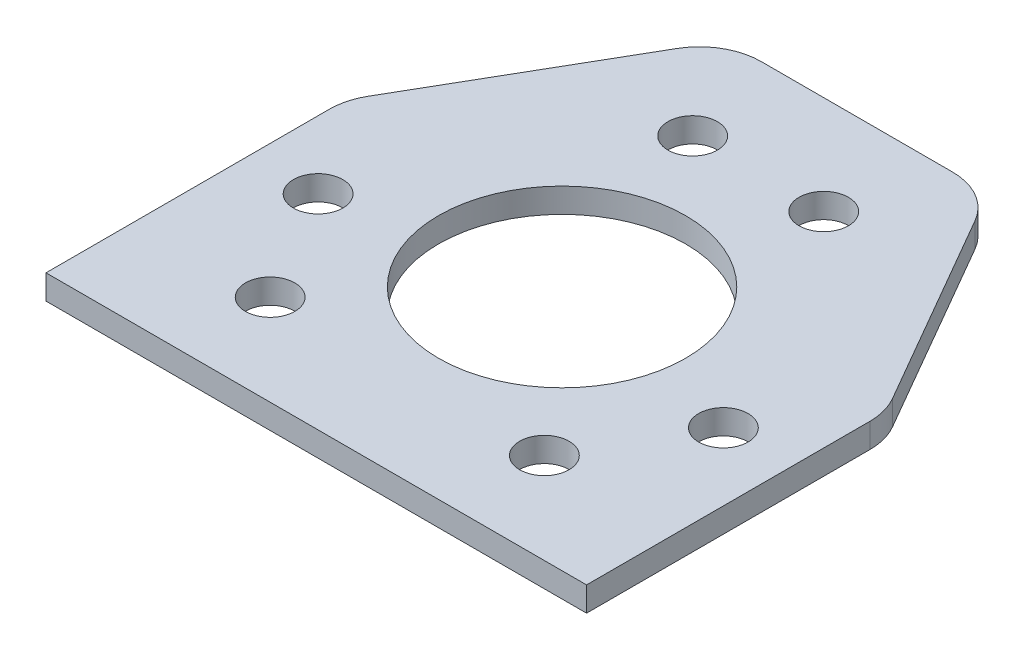
ISO-10303-21;
HEADER;
FILE_DESCRIPTION(('STEP AP214'),'2;1');
FILE_NAME('part.step','',(''),(''),'','','');
FILE_SCHEMA(('AUTOMOTIVE_DESIGN { 1 0 10303 214 1 1 1 1 }'));
ENDSEC;
DATA;
#1=APPLICATION_CONTEXT('core data for automotive mechanical design processes');
#2=APPLICATION_PROTOCOL_DEFINITION('international standard','automotive_design',2000,#1);
#3=PRODUCT_CONTEXT('',#1,'mechanical');
#4=PRODUCT('Part','Part','',(#3));
#5=PRODUCT_RELATED_PRODUCT_CATEGORY('part','',(#4));
#6=PRODUCT_DEFINITION_FORMATION('','',#4);
#7=PRODUCT_DEFINITION_CONTEXT('part definition',#1,'design');
#8=PRODUCT_DEFINITION('design','',#6,#7);
#9=PRODUCT_DEFINITION_SHAPE('','',#8);
#10=(LENGTH_UNIT() NAMED_UNIT(*) SI_UNIT(.MILLI.,.METRE.));
#11=(NAMED_UNIT(*) PLANE_ANGLE_UNIT() SI_UNIT($,.RADIAN.));
#12=(NAMED_UNIT(*) SI_UNIT($,.STERADIAN.) SOLID_ANGLE_UNIT());
#13=UNCERTAINTY_MEASURE_WITH_UNIT(LENGTH_MEASURE(1.E-05),#10,'distance_accuracy_value','');
#14=(GEOMETRIC_REPRESENTATION_CONTEXT(3) GLOBAL_UNCERTAINTY_ASSIGNED_CONTEXT((#13)) GLOBAL_UNIT_ASSIGNED_CONTEXT((#10,
#11,#12)) REPRESENTATION_CONTEXT('',''));
#15=CARTESIAN_POINT('',(0.,0.,0.));
#16=DIRECTION('',(0.,0.,1.));
#17=DIRECTION('',(1.,0.,0.));
#18=AXIS2_PLACEMENT_3D('',#15,#16,#17);
#19=CARTESIAN_POINT('',(0.,1.58750000000001,0.));
#20=DIRECTION('',(0.,1.,0.));
#21=DIRECTION('',(0.,0.,1.));
#22=AXIS2_PLACEMENT_3D('',#19,#20,#21);
#23=PLANE('',#22);
#24=CARTESIAN_POINT('',(-8.87720228450276,1.58749999999996,10.0242346141748));
#25=DIRECTION('',(0.,1.,0.));
#26=DIRECTION('',(0.,0.,1.));
#27=AXIS2_PLACEMENT_3D('',#24,#25,#26);
#28=CIRCLE('',#27,1.59999999999999);
#29=CARTESIAN_POINT('',(-8.87720228450276,1.58749999999996,11.6242346141748));
#30=VERTEX_POINT('',#29);
#31=EDGE_CURVE('E272',#30,#30,#28,.T.);
#32=ORIENTED_EDGE('',*,*,#31,.F.);
#33=EDGE_LOOP('',(#32));
#34=FACE_BOUND('',#33,.T.);
#35=CARTESIAN_POINT('',(-13.119842971622,1.58750000000001,2.67576538582523));
#36=DIRECTION('',(0.,1.,0.));
#37=DIRECTION('',(0.,0.,1.));
#38=AXIS2_PLACEMENT_3D('',#35,#36,#37);
#39=CIRCLE('',#38,1.59999999999999);
#40=CARTESIAN_POINT('',(-13.119842971622,1.58750000000001,4.27576538582522));
#41=VERTEX_POINT('',#40);
#42=EDGE_CURVE('E266',#41,#41,#39,.T.);
#43=ORIENTED_EDGE('',*,*,#42,.F.);
#44=EDGE_LOOP('',(#43));
#45=FACE_BOUND('',#44,.T.);
#46=CARTESIAN_POINT('',(-4.2426406871192,1.58749999999996,-12.7));
#47=DIRECTION('',(0.,1.,0.));
#48=DIRECTION('',(0.,0.,1.));
#49=AXIS2_PLACEMENT_3D('',#46,#47,#48);
#50=CIRCLE('',#49,1.59999999999999);
#51=CARTESIAN_POINT('',(-4.2426406871192,1.58749999999996,-11.1));
#52=VERTEX_POINT('',#51);
#53=EDGE_CURVE('E260',#52,#52,#50,.T.);
#54=ORIENTED_EDGE('',*,*,#53,.F.);
#55=EDGE_LOOP('',(#54));
#56=FACE_BOUND('',#55,.T.);
#57=CARTESIAN_POINT('',(4.24264068711939,1.58750000000001,-12.7));
#58=DIRECTION('',(0.,1.,0.));
#59=DIRECTION('',(0.,0.,1.));
#60=AXIS2_PLACEMENT_3D('',#57,#58,#59);
#61=CIRCLE('',#60,1.59999999999999);
#62=CARTESIAN_POINT('',(4.24264068711939,1.58750000000001,-11.1));
#63=VERTEX_POINT('',#62);
#64=EDGE_CURVE('E254',#63,#63,#61,.T.);
#65=ORIENTED_EDGE('',*,*,#64,.F.);
#66=EDGE_LOOP('',(#65));
#67=FACE_BOUND('',#66,.T.);
#68=CARTESIAN_POINT('',(13.119842971622,1.58749999999996,2.67576538582523));
#69=DIRECTION('',(0.,1.,0.));
#70=DIRECTION('',(0.,0.,1.));
#71=AXIS2_PLACEMENT_3D('',#68,#69,#70);
#72=CIRCLE('',#71,1.59999999999999);
#73=CARTESIAN_POINT('',(13.119842971622,1.58749999999996,4.27576538582522));
#74=VERTEX_POINT('',#73);
#75=EDGE_CURVE('E248',#74,#74,#72,.T.);
#76=ORIENTED_EDGE('',*,*,#75,.F.);
#77=EDGE_LOOP('',(#76));
#78=FACE_BOUND('',#77,.T.);
#79=CARTESIAN_POINT('',(8.8772022845027,1.58750000000001,10.0242346141748));
#80=DIRECTION('',(0.,1.,0.));
#81=DIRECTION('',(0.,0.,1.));
#82=AXIS2_PLACEMENT_3D('',#79,#80,#81);
#83=CIRCLE('',#82,1.59999999999999);
#84=CARTESIAN_POINT('',(8.8772022845027,1.58750000000001,11.6242346141748));
#85=VERTEX_POINT('',#84);
#86=EDGE_CURVE('E242',#85,#85,#83,.T.);
#87=ORIENTED_EDGE('',*,*,#86,.F.);
#88=EDGE_LOOP('',(#87));
#89=FACE_BOUND('',#88,.T.);
#90=DIRECTION('',(-0.500000000000001,0.,0.866025403784438));
#91=VECTOR('',#90,1.);
#92=CARTESIAN_POINT('',(-8.49999999999988,1.58749999999996,-19.0854174377006));
#93=LINE('',#92,#91);
#94=CARTESIAN_POINT('',(-9.65470053837914,1.58749999999996,-17.0854174377006));
#95=VERTEX_POINT('',#94);
#96=CARTESIAN_POINT('',(-16.9641016151377,1.58750000000001,-4.42516339985621));
#97=VERTEX_POINT('',#96);
#98=EDGE_CURVE('E140',#95,#97,#93,.T.);
#99=ORIENTED_EDGE('',*,*,#98,.T.);
#100=CARTESIAN_POINT('',(-13.5,1.58750000000001,-2.42516339985618));
#101=DIRECTION('',(0.,1.,0.));
#102=DIRECTION('',(0.,0.,1.));
#103=AXIS2_PLACEMENT_3D('',#100,#101,#102);
#104=CIRCLE('',#103,4.);
#105=CARTESIAN_POINT('',(-17.5,1.58750000000001,-2.42516339985618));
#106=VERTEX_POINT('',#105);
#107=EDGE_CURVE('E136',#97,#106,#104,.T.);
#108=ORIENTED_EDGE('',*,*,#107,.T.);
#109=DIRECTION('',(0.,0.,1.));
#110=VECTOR('',#109,1.);
#111=CARTESIAN_POINT('',(-17.5,1.58750000000001,-3.49696016958068));
#112=LINE('',#111,#110);
#113=CARTESIAN_POINT('',(-17.5,1.58750000000001,15.9145825622994));
#114=VERTEX_POINT('',#113);
#115=EDGE_CURVE('E127',#106,#114,#112,.T.);
#116=ORIENTED_EDGE('',*,*,#115,.T.);
#117=DIRECTION('',(1.,0.,0.));
#118=VECTOR('',#117,1.);
#119=CARTESIAN_POINT('',(-17.5,1.58750000000001,15.9145825622994));
#120=LINE('',#119,#118);
#121=CARTESIAN_POINT('',(17.5,1.58749999999995,15.9145825622994));
#122=VERTEX_POINT('',#121);
#123=EDGE_CURVE('E133',#114,#122,#120,.T.);
#124=ORIENTED_EDGE('',*,*,#123,.T.);
#125=DIRECTION('',(0.,0.,-1.));
#126=VECTOR('',#125,1.);
#127=CARTESIAN_POINT('',(17.5,1.58749999999995,-3.49696016958068));
#128=LINE('',#127,#126);
#129=CARTESIAN_POINT('',(17.5,1.58749999999995,-2.42516339985618));
#130=VERTEX_POINT('',#129);
#131=EDGE_CURVE('E155',#122,#130,#128,.T.);
#132=ORIENTED_EDGE('',*,*,#131,.T.);
#133=CARTESIAN_POINT('',(13.5,1.58749999999996,-2.42516339985618));
#134=DIRECTION('',(0.,1.,0.));
#135=DIRECTION('',(0.,0.,1.));
#136=AXIS2_PLACEMENT_3D('',#133,#134,#135);
#137=CIRCLE('',#136,4.);
#138=CARTESIAN_POINT('',(16.9641016151379,1.58749999999995,-4.42516339985621));
#139=VERTEX_POINT('',#138);
#140=EDGE_CURVE('E195',#130,#139,#137,.T.);
#141=ORIENTED_EDGE('',*,*,#140,.T.);
#142=DIRECTION('',(-0.500000000000001,0.,-0.866025403784438));
#143=VECTOR('',#142,1.);
#144=CARTESIAN_POINT('',(8.50000000000008,1.58750000000001,-19.0854174377006));
#145=LINE('',#144,#143);
#146=CARTESIAN_POINT('',(9.65470053837933,1.58750000000001,-17.0854174377006));
#147=VERTEX_POINT('',#146);
#148=EDGE_CURVE('E157',#139,#147,#145,.T.);
#149=ORIENTED_EDGE('',*,*,#148,.T.);
#150=CARTESIAN_POINT('',(6.19059892324157,1.58750000000001,-15.0854174377006));
#151=DIRECTION('',(0.,1.,0.));
#152=DIRECTION('',(0.,0.,1.));
#153=AXIS2_PLACEMENT_3D('',#150,#151,#152);
#154=CIRCLE('',#153,4.);
#155=CARTESIAN_POINT('',(6.19059892324157,1.58750000000001,-19.0854174377006));
#156=VERTEX_POINT('',#155);
#157=EDGE_CURVE('E73',#147,#156,#154,.T.);
#158=ORIENTED_EDGE('',*,*,#157,.T.);
#159=DIRECTION('',(-1.,0.,0.));
#160=VECTOR('',#159,1.);
#161=CARTESIAN_POINT('',(8.50000000000008,1.58750000000001,-19.0854174377006));
#162=LINE('',#161,#160);
#163=CARTESIAN_POINT('',(-6.19059892324138,1.58749999999996,-19.0854174377006));
#164=VERTEX_POINT('',#163);
#165=EDGE_CURVE('E162',#156,#164,#162,.T.);
#166=ORIENTED_EDGE('',*,*,#165,.T.);
#167=CARTESIAN_POINT('',(-6.19059892324138,1.58749999999996,-15.0854174377006));
#168=DIRECTION('',(0.,1.,0.));
#169=DIRECTION('',(0.,0.,1.));
#170=AXIS2_PLACEMENT_3D('',#167,#168,#169);
#171=CIRCLE('',#170,4.);
#172=EDGE_CURVE('E197',#164,#95,#171,.T.);
#173=ORIENTED_EDGE('',*,*,#172,.T.);
#174=EDGE_LOOP('',(#99,#108,#116,#124,#132,#141,#149,#158,#166,#173));
#175=FACE_BOUND('',#174,.T.);
#176=CARTESIAN_POINT('',(0.,1.58750000000001,0.));
#177=DIRECTION('',(0.,1.,0.));
#178=DIRECTION('',(0.,0.,1.));
#179=AXIS2_PLACEMENT_3D('',#176,#177,#178);
#180=CIRCLE('',#179,8.);
#181=CARTESIAN_POINT('',(0.,1.58750000000001,8.));
#182=VERTEX_POINT('',#181);
#183=EDGE_CURVE('E167',#182,#182,#180,.T.);
#184=ORIENTED_EDGE('',*,*,#183,.F.);
#185=EDGE_LOOP('',(#184));
#186=FACE_BOUND('',#185,.T.);
#187=ADVANCED_FACE('F51',(#34,#45,#56,#67,#78,#89,#175,#186),#23,.T.);
#188=CARTESIAN_POINT('',(0.,0.,0.));
#189=DIRECTION('',(0.,1.,0.));
#190=DIRECTION('',(0.,0.,1.));
#191=AXIS2_PLACEMENT_3D('',#188,#189,#190);
#192=PLANE('',#191);
#193=CARTESIAN_POINT('',(-8.87720228450273,0.,10.0242346141748));
#194=DIRECTION('',(0.,1.,0.));
#195=DIRECTION('',(0.,0.,1.));
#196=AXIS2_PLACEMENT_3D('',#193,#194,#195);
#197=CIRCLE('',#196,1.6);
#198=CARTESIAN_POINT('',(-8.87720228450273,0.,11.6242346141748));
#199=VERTEX_POINT('',#198);
#200=EDGE_CURVE('E269',#199,#199,#197,.T.);
#201=ORIENTED_EDGE('',*,*,#200,.T.);
#202=EDGE_LOOP('',(#201));
#203=FACE_BOUND('',#202,.T.);
#204=CARTESIAN_POINT('',(-13.119842971622,0.,2.67576538582523));
#205=DIRECTION('',(0.,1.,0.));
#206=DIRECTION('',(0.,0.,1.));
#207=AXIS2_PLACEMENT_3D('',#204,#205,#206);
#208=CIRCLE('',#207,1.6);
#209=CARTESIAN_POINT('',(-13.119842971622,0.,4.27576538582523));
#210=VERTEX_POINT('',#209);
#211=EDGE_CURVE('E263',#210,#210,#208,.T.);
#212=ORIENTED_EDGE('',*,*,#211,.T.);
#213=EDGE_LOOP('',(#212));
#214=FACE_BOUND('',#213,.T.);
#215=CARTESIAN_POINT('',(-4.24264068711917,0.,-12.7));
#216=DIRECTION('',(0.,1.,0.));
#217=DIRECTION('',(0.,0.,1.));
#218=AXIS2_PLACEMENT_3D('',#215,#216,#217);
#219=CIRCLE('',#218,1.6);
#220=CARTESIAN_POINT('',(-4.24264068711917,0.,-11.1));
#221=VERTEX_POINT('',#220);
#222=EDGE_CURVE('E257',#221,#221,#219,.T.);
#223=ORIENTED_EDGE('',*,*,#222,.T.);
#224=EDGE_LOOP('',(#223));
#225=FACE_BOUND('',#224,.T.);
#226=CARTESIAN_POINT('',(4.24264068711941,0.,-12.7));
#227=DIRECTION('',(0.,1.,0.));
#228=DIRECTION('',(0.,0.,1.));
#229=AXIS2_PLACEMENT_3D('',#226,#227,#228);
#230=CIRCLE('',#229,1.6);
#231=CARTESIAN_POINT('',(4.24264068711941,0.,-11.1));
#232=VERTEX_POINT('',#231);
#233=EDGE_CURVE('E251',#232,#232,#230,.T.);
#234=ORIENTED_EDGE('',*,*,#233,.T.);
#235=EDGE_LOOP('',(#234));
#236=FACE_BOUND('',#235,.T.);
#237=CARTESIAN_POINT('',(13.119842971622,0.,2.67576538582523));
#238=DIRECTION('',(0.,1.,0.));
#239=DIRECTION('',(0.,0.,1.));
#240=AXIS2_PLACEMENT_3D('',#237,#238,#239);
#241=CIRCLE('',#240,1.6);
#242=CARTESIAN_POINT('',(13.119842971622,0.,4.27576538582523));
#243=VERTEX_POINT('',#242);
#244=EDGE_CURVE('E245',#243,#243,#241,.T.);
#245=ORIENTED_EDGE('',*,*,#244,.T.);
#246=EDGE_LOOP('',(#245));
#247=FACE_BOUND('',#246,.T.);
#248=CARTESIAN_POINT('',(8.87720228450273,0.,10.0242346141748));
#249=DIRECTION('',(0.,1.,0.));
#250=DIRECTION('',(0.,0.,1.));
#251=AXIS2_PLACEMENT_3D('',#248,#249,#250);
#252=CIRCLE('',#251,1.6);
#253=CARTESIAN_POINT('',(8.87720228450273,0.,11.6242346141748));
#254=VERTEX_POINT('',#253);
#255=EDGE_CURVE('E237',#254,#254,#252,.T.);
#256=ORIENTED_EDGE('',*,*,#255,.T.);
#257=EDGE_LOOP('',(#256));
#258=FACE_BOUND('',#257,.T.);
#259=DIRECTION('',(0.,0.,1.));
#260=VECTOR('',#259,1.);
#261=CARTESIAN_POINT('',(-17.4999999999999,0.,-3.49696016958068));
#262=LINE('',#261,#260);
#263=CARTESIAN_POINT('',(-17.4999999999999,0.,-2.42516339985618));
#264=VERTEX_POINT('',#263);
#265=CARTESIAN_POINT('',(-17.5,0.,15.9145825622994));
#266=VERTEX_POINT('',#265);
#267=EDGE_CURVE('E146',#264,#266,#262,.T.);
#268=ORIENTED_EDGE('',*,*,#267,.F.);
#269=CARTESIAN_POINT('',(-13.4999999999999,0.,-2.42516339985618));
#270=DIRECTION('',(0.,1.,0.));
#271=DIRECTION('',(0.,0.,1.));
#272=AXIS2_PLACEMENT_3D('',#269,#270,#271);
#273=CIRCLE('',#272,4.);
#274=CARTESIAN_POINT('',(-16.9641016151376,0.,-4.42516339985621));
#275=VERTEX_POINT('',#274);
#276=EDGE_CURVE('E187',#264,#275,#273,.F.);
#277=ORIENTED_EDGE('',*,*,#276,.T.);
#278=DIRECTION('',(-0.500000000000001,0.,0.866025403784438));
#279=VECTOR('',#278,1.);
#280=CARTESIAN_POINT('',(-8.49999999999985,0.,-19.0854174377006));
#281=LINE('',#280,#279);
#282=CARTESIAN_POINT('',(-9.65470053837911,0.,-17.0854174377006));
#283=VERTEX_POINT('',#282);
#284=EDGE_CURVE('E164',#283,#275,#281,.T.);
#285=ORIENTED_EDGE('',*,*,#284,.F.);
#286=CARTESIAN_POINT('',(-6.19059892324135,0.,-15.0854174377006));
#287=DIRECTION('',(0.,1.,0.));
#288=DIRECTION('',(0.,0.,1.));
#289=AXIS2_PLACEMENT_3D('',#286,#287,#288);
#290=CIRCLE('',#289,4.);
#291=CARTESIAN_POINT('',(-6.19059892324135,0.,-19.0854174377006));
#292=VERTEX_POINT('',#291);
#293=EDGE_CURVE('E185',#283,#292,#290,.F.);
#294=ORIENTED_EDGE('',*,*,#293,.T.);
#295=DIRECTION('',(-1.,0.,0.));
#296=VECTOR('',#295,1.);
#297=CARTESIAN_POINT('',(8.5000000000001,0.,-19.0854174377006));
#298=LINE('',#297,#296);
#299=CARTESIAN_POINT('',(6.1905989232416,0.,-19.0854174377006));
#300=VERTEX_POINT('',#299);
#301=EDGE_CURVE('E177',#300,#292,#298,.T.);
#302=ORIENTED_EDGE('',*,*,#301,.F.);
#303=CARTESIAN_POINT('',(6.1905989232416,0.,-15.0854174377006));
#304=DIRECTION('',(0.,1.,0.));
#305=DIRECTION('',(0.,0.,1.));
#306=AXIS2_PLACEMENT_3D('',#303,#304,#305);
#307=CIRCLE('',#306,4.);
#308=CARTESIAN_POINT('',(9.65470053837936,0.,-17.0854174377006));
#309=VERTEX_POINT('',#308);
#310=EDGE_CURVE('E181',#300,#309,#307,.F.);
#311=ORIENTED_EDGE('',*,*,#310,.T.);
#312=DIRECTION('',(-0.500000000000001,0.,-0.866025403784438));
#313=VECTOR('',#312,1.);
#314=CARTESIAN_POINT('',(8.5000000000001,0.,-19.0854174377006));
#315=LINE('',#314,#313);
#316=CARTESIAN_POINT('',(16.9641016151379,0.,-4.42516339985621));
#317=VERTEX_POINT('',#316);
#318=EDGE_CURVE('E174',#317,#309,#315,.T.);
#319=ORIENTED_EDGE('',*,*,#318,.F.);
#320=CARTESIAN_POINT('',(13.5000000000001,0.,-2.42516339985618));
#321=DIRECTION('',(0.,1.,0.));
#322=DIRECTION('',(0.,0.,1.));
#323=AXIS2_PLACEMENT_3D('',#320,#321,#322);
#324=CIRCLE('',#323,4.);
#325=CARTESIAN_POINT('',(17.5000000000001,0.,-2.42516339985618));
#326=VERTEX_POINT('',#325);
#327=EDGE_CURVE('E183',#317,#326,#324,.F.);
#328=ORIENTED_EDGE('',*,*,#327,.T.);
#329=DIRECTION('',(0.,0.,-1.));
#330=VECTOR('',#329,1.);
#331=CARTESIAN_POINT('',(17.5000000000001,0.,-3.49696016958068));
#332=LINE('',#331,#330);
#333=CARTESIAN_POINT('',(17.5,0.,15.9145825622994));
#334=VERTEX_POINT('',#333);
#335=EDGE_CURVE('E171',#334,#326,#332,.T.);
#336=ORIENTED_EDGE('',*,*,#335,.F.);
#337=DIRECTION('',(1.,0.,0.));
#338=VECTOR('',#337,1.);
#339=CARTESIAN_POINT('',(-17.5,0.,15.9145825622994));
#340=LINE('',#339,#338);
#341=EDGE_CURVE('E169',#266,#334,#340,.T.);
#342=ORIENTED_EDGE('',*,*,#341,.F.);
#343=EDGE_LOOP('',(#268,#277,#285,#294,#302,#311,#319,#328,#336,#342));
#344=FACE_BOUND('',#343,.T.);
#345=CARTESIAN_POINT('',(0.,0.,0.));
#346=DIRECTION('',(0.,1.,0.));
#347=DIRECTION('',(0.,0.,1.));
#348=AXIS2_PLACEMENT_3D('',#345,#346,#347);
#349=CIRCLE('',#348,8.);
#350=CARTESIAN_POINT('',(0.,0.,8.));
#351=VERTEX_POINT('',#350);
#352=EDGE_CURVE('E234',#351,#351,#349,.T.);
#353=ORIENTED_EDGE('',*,*,#352,.T.);
#354=EDGE_LOOP('',(#353));
#355=FACE_BOUND('',#354,.T.);
#356=ADVANCED_FACE('F215',(#203,#214,#225,#236,#247,#258,#344,#355),#192,.F.);
#357=CARTESIAN_POINT('',(-8.49999999999988,1.58749999999996,-19.0854174377006));
#358=DIRECTION('',(0.866025403784438,0.,0.500000000000001));
#359=DIRECTION('',(0.500000000000001,0.,-0.866025403784438));
#360=AXIS2_PLACEMENT_3D('',#357,#358,#359);
#361=PLANE('',#360);
#362=ORIENTED_EDGE('',*,*,#284,.T.);
#363=DIRECTION('',(0.,-1.,0.));
#364=VECTOR('',#363,1.);
#365=CARTESIAN_POINT('',(-16.9641016151377,1.58750000000001,-4.42516339985619));
#366=LINE('',#365,#364);
#367=EDGE_CURVE('E192',#275,#97,#366,.F.);
#368=ORIENTED_EDGE('',*,*,#367,.T.);
#369=ORIENTED_EDGE('',*,*,#98,.F.);
#370=DIRECTION('',(0.,-1.,0.));
#371=VECTOR('',#370,1.);
#372=CARTESIAN_POINT('',(-9.65470053837914,1.58749999999996,-17.0854174377006));
#373=LINE('',#372,#371);
#374=EDGE_CURVE('E189',#95,#283,#373,.T.);
#375=ORIENTED_EDGE('',*,*,#374,.T.);
#376=EDGE_LOOP('',(#362,#368,#369,#375));
#377=FACE_BOUND('',#376,.T.);
#378=ADVANCED_FACE('F229',(#377),#361,.F.);
#379=CARTESIAN_POINT('',(-17.5,1.58750000000001,-3.49696016958068));
#380=DIRECTION('',(1.,0.,0.));
#381=DIRECTION('',(0.,0.,-1.));
#382=AXIS2_PLACEMENT_3D('',#379,#380,#381);
#383=PLANE('',#382);
#384=ORIENTED_EDGE('',*,*,#115,.F.);
#385=DIRECTION('',(0.,-1.,0.));
#386=VECTOR('',#385,1.);
#387=CARTESIAN_POINT('',(-17.5,1.58750000000001,-2.42516339985618));
#388=LINE('',#387,#386);
#389=EDGE_CURVE('E149',#106,#264,#388,.T.);
#390=ORIENTED_EDGE('',*,*,#389,.T.);
#391=ORIENTED_EDGE('',*,*,#267,.T.);
#392=DIRECTION('',(0.,-1.,0.));
#393=VECTOR('',#392,1.);
#394=CARTESIAN_POINT('',(-17.5,1.58750000000001,15.9145825622994));
#395=LINE('',#394,#393);
#396=EDGE_CURVE('E143',#114,#266,#395,.T.);
#397=ORIENTED_EDGE('',*,*,#396,.F.);
#398=EDGE_LOOP('',(#384,#390,#391,#397));
#399=FACE_BOUND('',#398,.T.);
#400=ADVANCED_FACE('F144',(#399),#383,.F.);
#401=CARTESIAN_POINT('',(-17.5,1.58750000000001,15.9145825622994));
#402=DIRECTION('',(0.,0.,-1.));
#403=DIRECTION('',(-1.,0.,0.));
#404=AXIS2_PLACEMENT_3D('',#401,#402,#403);
#405=PLANE('',#404);
#406=ORIENTED_EDGE('',*,*,#341,.T.);
#407=DIRECTION('',(0.,-1.,0.));
#408=VECTOR('',#407,1.);
#409=CARTESIAN_POINT('',(17.5,1.58749999999995,15.9145825622994));
#410=LINE('',#409,#408);
#411=EDGE_CURVE('E150',#122,#334,#410,.T.);
#412=ORIENTED_EDGE('',*,*,#411,.F.);
#413=ORIENTED_EDGE('',*,*,#123,.F.);
#414=ORIENTED_EDGE('',*,*,#396,.T.);
#415=EDGE_LOOP('',(#406,#412,#413,#414));
#416=FACE_BOUND('',#415,.T.);
#417=ADVANCED_FACE('F152',(#416),#405,.F.);
#418=CARTESIAN_POINT('',(17.5,1.58749999999995,-3.49696016958068));
#419=DIRECTION('',(-1.,0.,0.));
#420=DIRECTION('',(0.,0.,1.));
#421=AXIS2_PLACEMENT_3D('',#418,#419,#420);
#422=PLANE('',#421);
#423=ORIENTED_EDGE('',*,*,#335,.T.);
#424=DIRECTION('',(0.,-1.,0.));
#425=VECTOR('',#424,1.);
#426=CARTESIAN_POINT('',(17.5,1.58749999999995,-2.42516339985618));
#427=LINE('',#426,#425);
#428=EDGE_CURVE('E13',#326,#130,#427,.F.);
#429=ORIENTED_EDGE('',*,*,#428,.T.);
#430=ORIENTED_EDGE('',*,*,#131,.F.);
#431=ORIENTED_EDGE('',*,*,#411,.T.);
#432=EDGE_LOOP('',(#423,#429,#430,#431));
#433=FACE_BOUND('',#432,.T.);
#434=ADVANCED_FACE('F316',(#433),#422,.F.);
#435=CARTESIAN_POINT('',(8.50000000000008,1.58750000000001,-19.0854174377006));
#436=DIRECTION('',(-0.866025403784438,0.,0.500000000000001));
#437=DIRECTION('',(0.500000000000001,0.,0.866025403784438));
#438=AXIS2_PLACEMENT_3D('',#435,#436,#437);
#439=PLANE('',#438);
#440=ORIENTED_EDGE('',*,*,#148,.F.);
#441=DIRECTION('',(0.,-1.,0.));
#442=VECTOR('',#441,1.);
#443=CARTESIAN_POINT('',(16.9641016151379,1.58749999999995,-4.42516339985619));
#444=LINE('',#443,#442);
#445=EDGE_CURVE('E59',#139,#317,#444,.T.);
#446=ORIENTED_EDGE('',*,*,#445,.T.);
#447=ORIENTED_EDGE('',*,*,#318,.T.);
#448=DIRECTION('',(0.,-1.,0.));
#449=VECTOR('',#448,1.);
#450=CARTESIAN_POINT('',(9.65470053837933,1.58750000000001,-17.0854174377006));
#451=LINE('',#450,#449);
#452=EDGE_CURVE('E204',#309,#147,#451,.F.);
#453=ORIENTED_EDGE('',*,*,#452,.T.);
#454=EDGE_LOOP('',(#440,#446,#447,#453));
#455=FACE_BOUND('',#454,.T.);
#456=ADVANCED_FACE('F210',(#455),#439,.F.);
#457=CARTESIAN_POINT('',(8.50000000000008,1.58750000000001,-19.0854174377006));
#458=DIRECTION('',(0.,0.,1.));
#459=DIRECTION('',(1.,0.,0.));
#460=AXIS2_PLACEMENT_3D('',#457,#458,#459);
#461=PLANE('',#460);
#462=ORIENTED_EDGE('',*,*,#301,.T.);
#463=DIRECTION('',(0.,-1.,0.));
#464=VECTOR('',#463,1.);
#465=CARTESIAN_POINT('',(-6.19059892324138,1.58749999999996,-19.0854174377006));
#466=LINE('',#465,#464);
#467=EDGE_CURVE('E66',#292,#164,#466,.F.);
#468=ORIENTED_EDGE('',*,*,#467,.T.);
#469=ORIENTED_EDGE('',*,*,#165,.F.);
#470=DIRECTION('',(0.,-1.,0.));
#471=VECTOR('',#470,1.);
#472=CARTESIAN_POINT('',(6.19059892324157,1.58750000000001,-19.0854174377006));
#473=LINE('',#472,#471);
#474=EDGE_CURVE('E200',#156,#300,#473,.T.);
#475=ORIENTED_EDGE('',*,*,#474,.T.);
#476=EDGE_LOOP('',(#462,#468,#469,#475));
#477=FACE_BOUND('',#476,.T.);
#478=ADVANCED_FACE('F221',(#477),#461,.F.);
#479=CARTESIAN_POINT('',(0.,1.58750000000001,0.));
#480=DIRECTION('',(0.,-1.,0.));
#481=DIRECTION('',(0.,0.,-1.));
#482=AXIS2_PLACEMENT_3D('',#479,#480,#481);
#483=CYLINDRICAL_SURFACE('',#482,8.);
#484=ORIENTED_EDGE('',*,*,#183,.T.);
#485=EDGE_LOOP('',(#484));
#486=FACE_BOUND('',#485,.T.);
#487=ORIENTED_EDGE('',*,*,#352,.F.);
#488=EDGE_LOOP('',(#487));
#489=FACE_BOUND('',#488,.T.);
#490=ADVANCED_FACE('F294',(#486,#489),#483,.F.);
#491=CARTESIAN_POINT('',(8.8772022845027,1.58750000000001,10.0242346141748));
#492=DIRECTION('',(0.,1.,0.));
#493=DIRECTION('',(0.,0.,1.));
#494=AXIS2_PLACEMENT_3D('',#491,#492,#493);
#495=CYLINDRICAL_SURFACE('',#494,1.59999999999999);
#496=ORIENTED_EDGE('',*,*,#255,.F.);
#497=EDGE_LOOP('',(#496));
#498=FACE_BOUND('',#497,.T.);
#499=ORIENTED_EDGE('',*,*,#86,.T.);
#500=EDGE_LOOP('',(#499));
#501=FACE_BOUND('',#500,.T.);
#502=ADVANCED_FACE('F291',(#498,#501),#495,.F.);
#503=CARTESIAN_POINT('',(13.119842971622,1.58749999999996,2.67576538582523));
#504=DIRECTION('',(0.,1.,0.));
#505=DIRECTION('',(0.,0.,1.));
#506=AXIS2_PLACEMENT_3D('',#503,#504,#505);
#507=CYLINDRICAL_SURFACE('',#506,1.59999999999999);
#508=ORIENTED_EDGE('',*,*,#244,.F.);
#509=EDGE_LOOP('',(#508));
#510=FACE_BOUND('',#509,.T.);
#511=ORIENTED_EDGE('',*,*,#75,.T.);
#512=EDGE_LOOP('',(#511));
#513=FACE_BOUND('',#512,.T.);
#514=ADVANCED_FACE('F293',(#510,#513),#507,.F.);
#515=CARTESIAN_POINT('',(4.24264068711939,1.58750000000001,-12.7));
#516=DIRECTION('',(0.,1.,0.));
#517=DIRECTION('',(0.,0.,1.));
#518=AXIS2_PLACEMENT_3D('',#515,#516,#517);
#519=CYLINDRICAL_SURFACE('',#518,1.59999999999999);
#520=ORIENTED_EDGE('',*,*,#233,.F.);
#521=EDGE_LOOP('',(#520));
#522=FACE_BOUND('',#521,.T.);
#523=ORIENTED_EDGE('',*,*,#64,.T.);
#524=EDGE_LOOP('',(#523));
#525=FACE_BOUND('',#524,.T.);
#526=ADVANCED_FACE('F301',(#522,#525),#519,.F.);
#527=CARTESIAN_POINT('',(-4.2426406871192,1.58749999999995,-12.7));
#528=DIRECTION('',(0.,1.,0.));
#529=DIRECTION('',(0.,0.,1.));
#530=AXIS2_PLACEMENT_3D('',#527,#528,#529);
#531=CYLINDRICAL_SURFACE('',#530,1.59999999999999);
#532=ORIENTED_EDGE('',*,*,#222,.F.);
#533=EDGE_LOOP('',(#532));
#534=FACE_BOUND('',#533,.T.);
#535=ORIENTED_EDGE('',*,*,#53,.T.);
#536=EDGE_LOOP('',(#535));
#537=FACE_BOUND('',#536,.T.);
#538=ADVANCED_FACE('F362',(#534,#537),#531,.F.);
#539=CARTESIAN_POINT('',(-13.119842971622,1.58750000000001,2.67576538582523));
#540=DIRECTION('',(0.,1.,0.));
#541=DIRECTION('',(0.,0.,1.));
#542=AXIS2_PLACEMENT_3D('',#539,#540,#541);
#543=CYLINDRICAL_SURFACE('',#542,1.59999999999999);
#544=ORIENTED_EDGE('',*,*,#211,.F.);
#545=EDGE_LOOP('',(#544));
#546=FACE_BOUND('',#545,.T.);
#547=ORIENTED_EDGE('',*,*,#42,.T.);
#548=EDGE_LOOP('',(#547));
#549=FACE_BOUND('',#548,.T.);
#550=ADVANCED_FACE('F354',(#546,#549),#543,.F.);
#551=CARTESIAN_POINT('',(-8.87720228450276,1.58749999999996,10.0242346141748));
#552=DIRECTION('',(0.,1.,0.));
#553=DIRECTION('',(0.,0.,1.));
#554=AXIS2_PLACEMENT_3D('',#551,#552,#553);
#555=CYLINDRICAL_SURFACE('',#554,1.59999999999999);
#556=ORIENTED_EDGE('',*,*,#200,.F.);
#557=EDGE_LOOP('',(#556));
#558=FACE_BOUND('',#557,.T.);
#559=ORIENTED_EDGE('',*,*,#31,.T.);
#560=EDGE_LOOP('',(#559));
#561=FACE_BOUND('',#560,.T.);
#562=ADVANCED_FACE('F276',(#558,#561),#555,.F.);
#563=CARTESIAN_POINT('',(-13.5,1.58750000000001,-2.42516339985618));
#564=DIRECTION('',(0.,-1.,0.));
#565=DIRECTION('',(0.,0.,-1.));
#566=AXIS2_PLACEMENT_3D('',#563,#564,#565);
#567=CYLINDRICAL_SURFACE('',#566,4.);
#568=ORIENTED_EDGE('',*,*,#107,.F.);
#569=ORIENTED_EDGE('',*,*,#367,.F.);
#570=ORIENTED_EDGE('',*,*,#276,.F.);
#571=ORIENTED_EDGE('',*,*,#389,.F.);
#572=EDGE_LOOP('',(#568,#569,#570,#571));
#573=FACE_BOUND('',#572,.T.);
#574=ADVANCED_FACE('F232',(#573),#567,.T.);
#575=CARTESIAN_POINT('',(-6.19059892324138,1.58749999999996,-15.0854174377006));
#576=DIRECTION('',(0.,-1.,0.));
#577=DIRECTION('',(0.,0.,-1.));
#578=AXIS2_PLACEMENT_3D('',#575,#576,#577);
#579=CYLINDRICAL_SURFACE('',#578,4.);
#580=ORIENTED_EDGE('',*,*,#172,.F.);
#581=ORIENTED_EDGE('',*,*,#467,.F.);
#582=ORIENTED_EDGE('',*,*,#293,.F.);
#583=ORIENTED_EDGE('',*,*,#374,.F.);
#584=EDGE_LOOP('',(#580,#581,#582,#583));
#585=FACE_BOUND('',#584,.T.);
#586=ADVANCED_FACE('F226',(#585),#579,.T.);
#587=CARTESIAN_POINT('',(13.5,1.58749999999996,-2.42516339985618));
#588=DIRECTION('',(0.,-1.,0.));
#589=DIRECTION('',(0.,0.,-1.));
#590=AXIS2_PLACEMENT_3D('',#587,#588,#589);
#591=CYLINDRICAL_SURFACE('',#590,4.);
#592=ORIENTED_EDGE('',*,*,#140,.F.);
#593=ORIENTED_EDGE('',*,*,#428,.F.);
#594=ORIENTED_EDGE('',*,*,#327,.F.);
#595=ORIENTED_EDGE('',*,*,#445,.F.);
#596=EDGE_LOOP('',(#592,#593,#594,#595));
#597=FACE_BOUND('',#596,.T.);
#598=ADVANCED_FACE('F329',(#597),#591,.T.);
#599=CARTESIAN_POINT('',(6.19059892324157,1.58750000000001,-15.0854174377006));
#600=DIRECTION('',(0.,-1.,0.));
#601=DIRECTION('',(0.,0.,-1.));
#602=AXIS2_PLACEMENT_3D('',#599,#600,#601);
#603=CYLINDRICAL_SURFACE('',#602,4.);
#604=ORIENTED_EDGE('',*,*,#157,.F.);
#605=ORIENTED_EDGE('',*,*,#452,.F.);
#606=ORIENTED_EDGE('',*,*,#310,.F.);
#607=ORIENTED_EDGE('',*,*,#474,.F.);
#608=EDGE_LOOP('',(#604,#605,#606,#607));
#609=FACE_BOUND('',#608,.T.);
#610=ADVANCED_FACE('F53',(#609),#603,.T.);
#611=CLOSED_SHELL('',(#187,#356,#378,#400,#417,#434,#456,#478,#490,#502,#514,#526,#538,#550,
#562,#574,#586,#598,#610));
#612=MANIFOLD_SOLID_BREP('B2',#611);
#613=ADVANCED_BREP_SHAPE_REPRESENTATION('',(#18,#612),#14);
#614=SHAPE_DEFINITION_REPRESENTATION(#9,#613);
ENDSEC;
END-ISO-10303-21;
